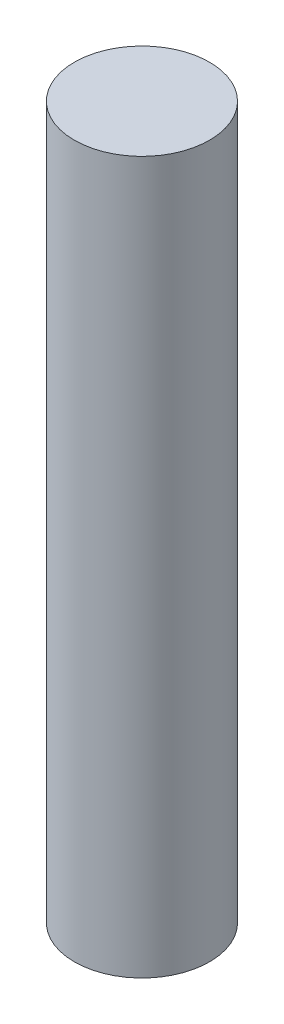
ISO-10303-21;
HEADER;
FILE_DESCRIPTION(('STEP AP214'),'2;1');
FILE_NAME('part.step','',(''),(''),'','','');
FILE_SCHEMA(('AUTOMOTIVE_DESIGN { 1 0 10303 214 1 1 1 1 }'));
ENDSEC;
DATA;
#1=APPLICATION_CONTEXT('core data for automotive mechanical design processes');
#2=APPLICATION_PROTOCOL_DEFINITION('international standard','automotive_design',2000,#1);
#3=PRODUCT_CONTEXT('',#1,'mechanical');
#4=PRODUCT('Part','Part','',(#3));
#5=PRODUCT_RELATED_PRODUCT_CATEGORY('part','',(#4));
#6=PRODUCT_DEFINITION_FORMATION('','',#4);
#7=PRODUCT_DEFINITION_CONTEXT('part definition',#1,'design');
#8=PRODUCT_DEFINITION('design','',#6,#7);
#9=PRODUCT_DEFINITION_SHAPE('','',#8);
#10=(LENGTH_UNIT() NAMED_UNIT(*) SI_UNIT(.MILLI.,.METRE.));
#11=(NAMED_UNIT(*) PLANE_ANGLE_UNIT() SI_UNIT($,.RADIAN.));
#12=(NAMED_UNIT(*) SI_UNIT($,.STERADIAN.) SOLID_ANGLE_UNIT());
#13=UNCERTAINTY_MEASURE_WITH_UNIT(LENGTH_MEASURE(1.E-05),#10,'distance_accuracy_value','');
#14=(GEOMETRIC_REPRESENTATION_CONTEXT(3) GLOBAL_UNCERTAINTY_ASSIGNED_CONTEXT((#13)) GLOBAL_UNIT_ASSIGNED_CONTEXT((#10,
#11,#12)) REPRESENTATION_CONTEXT('',''));
#15=CARTESIAN_POINT('',(0.,0.,0.));
#16=DIRECTION('',(0.,0.,1.));
#17=DIRECTION('',(1.,0.,0.));
#18=AXIS2_PLACEMENT_3D('',#15,#16,#17);
#19=CARTESIAN_POINT('',(0.,5.,0.));
#20=DIRECTION('',(0.,-1.,0.));
#21=DIRECTION('',(0.,0.,-1.));
#22=AXIS2_PLACEMENT_3D('',#19,#20,#21);
#23=CYLINDRICAL_SURFACE('',#22,0.95);
#24=CARTESIAN_POINT('',(0.,5.,0.));
#25=DIRECTION('',(0.,1.,0.));
#26=DIRECTION('',(0.,0.,1.));
#27=AXIS2_PLACEMENT_3D('',#24,#25,#26);
#28=CIRCLE('',#27,0.95);
#29=CARTESIAN_POINT('',(0.,5.,0.95));
#30=VERTEX_POINT('',#29);
#31=EDGE_CURVE('E10',#30,#30,#28,.T.);
#32=ORIENTED_EDGE('',*,*,#31,.F.);
#33=EDGE_LOOP('',(#32));
#34=FACE_BOUND('',#33,.T.);
#35=CARTESIAN_POINT('',(0.,-5.,0.));
#36=DIRECTION('',(0.,1.,0.));
#37=DIRECTION('',(0.,0.,1.));
#38=AXIS2_PLACEMENT_3D('',#35,#36,#37);
#39=CIRCLE('',#38,0.95);
#40=CARTESIAN_POINT('',(0.,-5.,0.95));
#41=VERTEX_POINT('',#40);
#42=EDGE_CURVE('E34',#41,#41,#39,.T.);
#43=ORIENTED_EDGE('',*,*,#42,.T.);
#44=EDGE_LOOP('',(#43));
#45=FACE_BOUND('',#44,.T.);
#46=ADVANCED_FACE('F31',(#34,#45),#23,.T.);
#47=CARTESIAN_POINT('',(0.,5.,0.));
#48=DIRECTION('',(0.,1.,0.));
#49=DIRECTION('',(0.,0.,1.));
#50=AXIS2_PLACEMENT_3D('',#47,#48,#49);
#51=PLANE('',#50);
#52=ORIENTED_EDGE('',*,*,#31,.T.);
#53=EDGE_LOOP('',(#52));
#54=FACE_BOUND('',#53,.T.);
#55=ADVANCED_FACE('F46',(#54),#51,.T.);
#56=CARTESIAN_POINT('',(0.,-5.,0.));
#57=DIRECTION('',(0.,1.,0.));
#58=DIRECTION('',(0.,0.,1.));
#59=AXIS2_PLACEMENT_3D('',#56,#57,#58);
#60=PLANE('',#59);
#61=ORIENTED_EDGE('',*,*,#42,.F.);
#62=EDGE_LOOP('',(#61));
#63=FACE_BOUND('',#62,.T.);
#64=ADVANCED_FACE('F44',(#63),#60,.F.);
#65=CLOSED_SHELL('',(#46,#55,#64));
#66=MANIFOLD_SOLID_BREP('B2',#65);
#67=ADVANCED_BREP_SHAPE_REPRESENTATION('',(#18,#66),#14);
#68=SHAPE_DEFINITION_REPRESENTATION(#9,#67);
ENDSEC;
END-ISO-10303-21;
